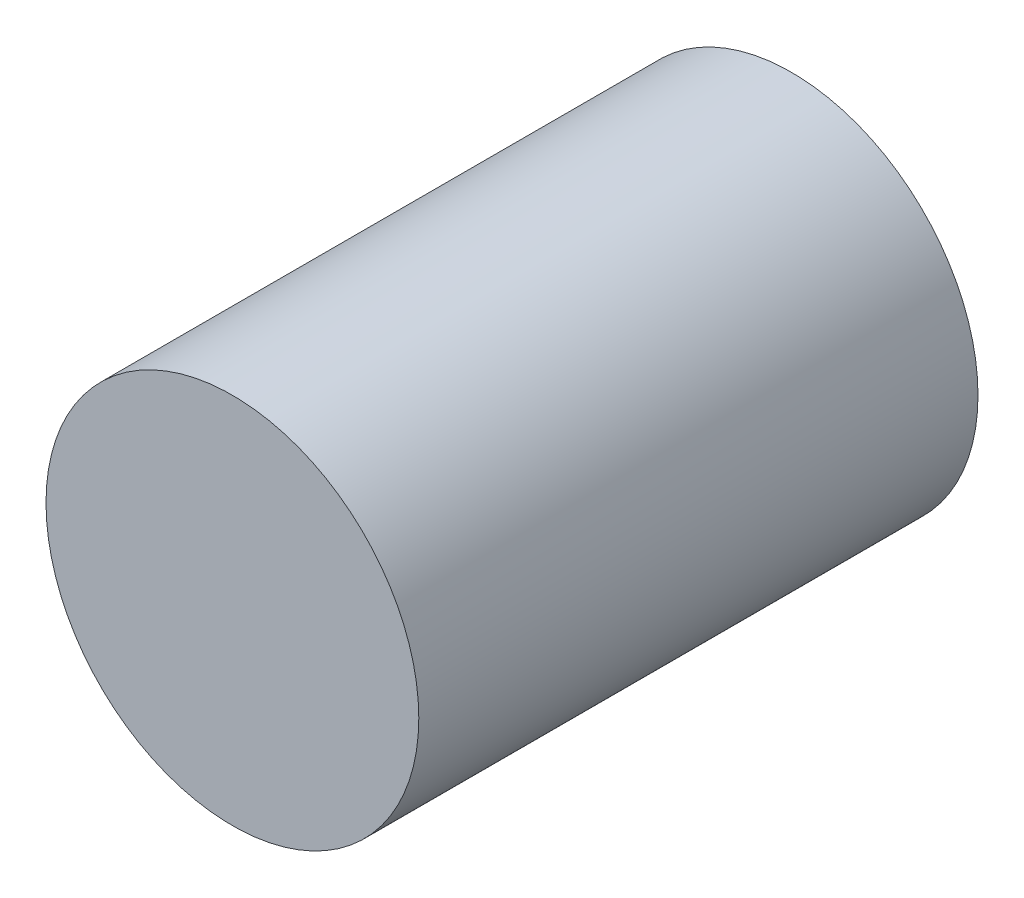
ISO-10303-21;
HEADER;
FILE_DESCRIPTION(('STEP AP214'),'2;1');
FILE_NAME('part.step','',(''),(''),'','','');
FILE_SCHEMA(('AUTOMOTIVE_DESIGN { 1 0 10303 214 1 1 1 1 }'));
ENDSEC;
DATA;
#1=APPLICATION_CONTEXT('core data for automotive mechanical design processes');
#2=APPLICATION_PROTOCOL_DEFINITION('international standard','automotive_design',2000,#1);
#3=PRODUCT_CONTEXT('',#1,'mechanical');
#4=PRODUCT('Part','Part','',(#3));
#5=PRODUCT_RELATED_PRODUCT_CATEGORY('part','',(#4));
#6=PRODUCT_DEFINITION_FORMATION('','',#4);
#7=PRODUCT_DEFINITION_CONTEXT('part definition',#1,'design');
#8=PRODUCT_DEFINITION('design','',#6,#7);
#9=PRODUCT_DEFINITION_SHAPE('','',#8);
#10=(LENGTH_UNIT() NAMED_UNIT(*) SI_UNIT(.MILLI.,.METRE.));
#11=(NAMED_UNIT(*) PLANE_ANGLE_UNIT() SI_UNIT($,.RADIAN.));
#12=(NAMED_UNIT(*) SI_UNIT($,.STERADIAN.) SOLID_ANGLE_UNIT());
#13=UNCERTAINTY_MEASURE_WITH_UNIT(LENGTH_MEASURE(1.E-05),#10,'distance_accuracy_value','');
#14=(GEOMETRIC_REPRESENTATION_CONTEXT(3) GLOBAL_UNCERTAINTY_ASSIGNED_CONTEXT((#13)) GLOBAL_UNIT_ASSIGNED_CONTEXT((#10,
#11,#12)) REPRESENTATION_CONTEXT('',''));
#15=CARTESIAN_POINT('',(0.,0.,0.));
#16=DIRECTION('',(0.,0.,1.));
#17=DIRECTION('',(1.,0.,0.));
#18=AXIS2_PLACEMENT_3D('',#15,#16,#17);
#19=CARTESIAN_POINT('',(0.,0.,14.));
#20=DIRECTION('',(0.,0.,1.));
#21=DIRECTION('',(1.,0.,0.));
#22=AXIS2_PLACEMENT_3D('',#19,#20,#21);
#23=PLANE('',#22);
#24=CARTESIAN_POINT('',(0.,0.,14.));
#25=DIRECTION('',(0.,0.,1.));
#26=DIRECTION('',(1.,0.,0.));
#27=AXIS2_PLACEMENT_3D('',#24,#25,#26);
#28=CIRCLE('',#27,0.5);
#29=CARTESIAN_POINT('',(0.5,0.,14.));
#30=VERTEX_POINT('',#29);
#31=CARTESIAN_POINT('',(-0.5,0.,14.));
#32=VERTEX_POINT('',#31);
#33=EDGE_CURVE('E11',#30,#32,#28,.T.);
#34=ORIENTED_EDGE('',*,*,#33,.F.);
#35=CARTESIAN_POINT('',(0.,0.,14.));
#36=DIRECTION('',(0.,0.,1.));
#37=DIRECTION('',(1.,0.,0.));
#38=AXIS2_PLACEMENT_3D('',#35,#36,#37);
#39=CIRCLE('',#38,0.5);
#40=EDGE_CURVE('E27',#32,#30,#39,.T.);
#41=ORIENTED_EDGE('',*,*,#40,.F.);
#42=EDGE_LOOP('',(#34,#41));
#43=FACE_BOUND('',#42,.T.);
#44=ADVANCED_FACE('F16',(#43),#23,.F.);
#45=CARTESIAN_POINT('',(0.,0.,15.5));
#46=DIRECTION('',(0.,0.,1.));
#47=DIRECTION('',(1.,0.,0.));
#48=AXIS2_PLACEMENT_3D('',#45,#46,#47);
#49=PLANE('',#48);
#50=CARTESIAN_POINT('',(0.,0.,15.5));
#51=DIRECTION('',(0.,0.,1.));
#52=DIRECTION('',(1.,0.,0.));
#53=AXIS2_PLACEMENT_3D('',#50,#51,#52);
#54=CIRCLE('',#53,0.5);
#55=CARTESIAN_POINT('',(0.5,0.,15.5));
#56=VERTEX_POINT('',#55);
#57=CARTESIAN_POINT('',(-0.5,0.,15.5));
#58=VERTEX_POINT('',#57);
#59=EDGE_CURVE('E20',#56,#58,#54,.T.);
#60=ORIENTED_EDGE('',*,*,#59,.T.);
#61=CARTESIAN_POINT('',(0.,0.,15.5));
#62=DIRECTION('',(0.,0.,1.));
#63=DIRECTION('',(1.,0.,0.));
#64=AXIS2_PLACEMENT_3D('',#61,#62,#63);
#65=CIRCLE('',#64,0.5);
#66=EDGE_CURVE('E54',#58,#56,#65,.T.);
#67=ORIENTED_EDGE('',*,*,#66,.T.);
#68=EDGE_LOOP('',(#60,#67));
#69=FACE_BOUND('',#68,.T.);
#70=ADVANCED_FACE('F18',(#69),#49,.T.);
#71=CARTESIAN_POINT('',(0.,0.,14.));
#72=DIRECTION('',(0.,0.,1.));
#73=DIRECTION('',(1.,0.,0.));
#74=AXIS2_PLACEMENT_3D('',#71,#72,#73);
#75=CYLINDRICAL_SURFACE('',#74,0.5);
#76=ORIENTED_EDGE('',*,*,#59,.F.);
#77=ORIENTED_EDGE('',*,*,#66,.F.);
#78=DIRECTION('',(0.,0.,-1.));
#79=VECTOR('',#78,1.);
#80=CARTESIAN_POINT('',(-0.5,0.,14.));
#81=LINE('',#80,#79);
#82=EDGE_CURVE('E47',#58,#32,#81,.T.);
#83=ORIENTED_EDGE('',*,*,#82,.T.);
#84=ORIENTED_EDGE('',*,*,#40,.T.);
#85=ORIENTED_EDGE('',*,*,#33,.T.);
#86=ORIENTED_EDGE('',*,*,#82,.F.);
#87=EDGE_LOOP('',(#76,#77,#83,#84,#85,#86));
#88=FACE_BOUND('',#87,.T.);
#89=ADVANCED_FACE('F57',(#88),#75,.T.);
#90=CLOSED_SHELL('',(#44,#70,#89));
#91=MANIFOLD_SOLID_BREP('B1',#90);
#92=ADVANCED_BREP_SHAPE_REPRESENTATION('',(#18,#91),#14);
#93=SHAPE_DEFINITION_REPRESENTATION(#9,#92);
ENDSEC;
END-ISO-10303-21;
